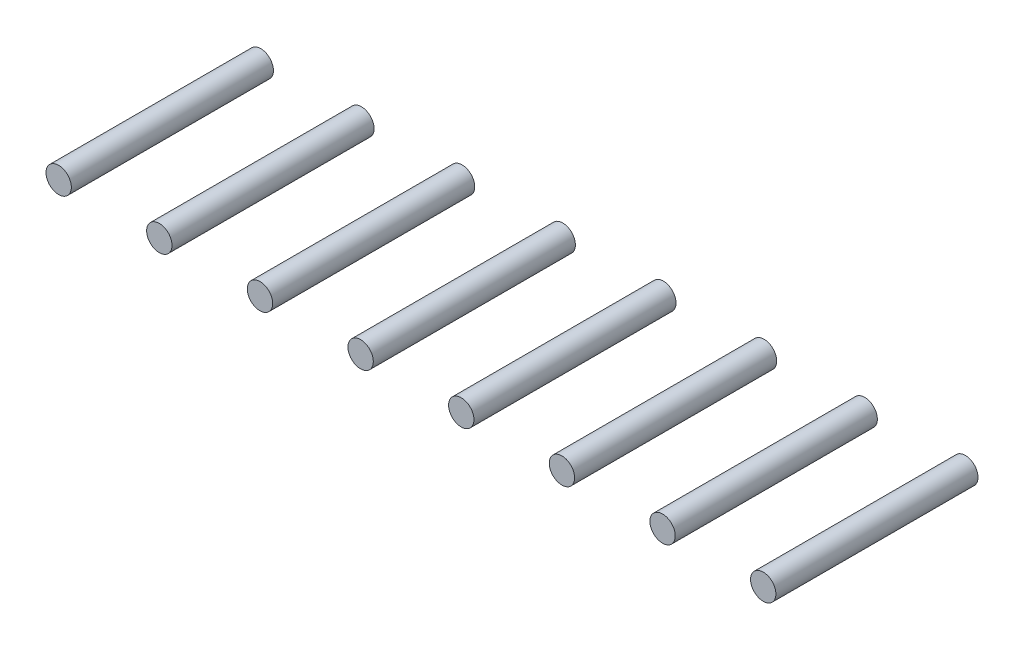
ISO-10303-21;
HEADER;
FILE_DESCRIPTION(('STEP AP214'),'2;1');
FILE_NAME('part.step','',(''),(''),'','','');
FILE_SCHEMA(('AUTOMOTIVE_DESIGN { 1 0 10303 214 1 1 1 1 }'));
ENDSEC;
DATA;
#1=APPLICATION_CONTEXT('core data for automotive mechanical design processes');
#2=APPLICATION_PROTOCOL_DEFINITION('international standard','automotive_design',2000,#1);
#3=PRODUCT_CONTEXT('',#1,'mechanical');
#4=PRODUCT('Part','Part','',(#3));
#5=PRODUCT_RELATED_PRODUCT_CATEGORY('part','',(#4));
#6=PRODUCT_DEFINITION_FORMATION('','',#4);
#7=PRODUCT_DEFINITION_CONTEXT('part definition',#1,'design');
#8=PRODUCT_DEFINITION('design','',#6,#7);
#9=PRODUCT_DEFINITION_SHAPE('','',#8);
#10=(LENGTH_UNIT() NAMED_UNIT(*) SI_UNIT(.MILLI.,.METRE.));
#11=(NAMED_UNIT(*) PLANE_ANGLE_UNIT() SI_UNIT($,.RADIAN.));
#12=(NAMED_UNIT(*) SI_UNIT($,.STERADIAN.) SOLID_ANGLE_UNIT());
#13=UNCERTAINTY_MEASURE_WITH_UNIT(LENGTH_MEASURE(1.E-05),#10,'distance_accuracy_value','');
#14=(GEOMETRIC_REPRESENTATION_CONTEXT(3) GLOBAL_UNCERTAINTY_ASSIGNED_CONTEXT((#13)) GLOBAL_UNIT_ASSIGNED_CONTEXT((#10,
#11,#12)) REPRESENTATION_CONTEXT('',''));
#15=CARTESIAN_POINT('',(0.,0.,0.));
#16=DIRECTION('',(0.,0.,1.));
#17=DIRECTION('',(1.,0.,0.));
#18=AXIS2_PLACEMENT_3D('',#15,#16,#17);
#19=CARTESIAN_POINT('',(0.,0.,-5.));
#20=DIRECTION('',(0.,0.,1.));
#21=DIRECTION('',(1.,0.,0.));
#22=AXIS2_PLACEMENT_3D('',#19,#20,#21);
#23=PLANE('',#22);
#24=CARTESIAN_POINT('',(0.,0.,-5.));
#25=DIRECTION('',(0.,0.,1.));
#26=DIRECTION('',(1.,0.,0.));
#27=AXIS2_PLACEMENT_3D('',#24,#25,#26);
#28=CIRCLE('',#27,0.32);
#29=CARTESIAN_POINT('',(0.32,0.,-5.));
#30=VERTEX_POINT('',#29);
#31=EDGE_CURVE('P0_E11',#30,#30,#28,.T.);
#32=ORIENTED_EDGE('',*,*,#31,.F.);
#33=EDGE_LOOP('',(#32));
#34=FACE_BOUND('',#33,.T.);
#35=ADVANCED_FACE('P0_F16',(#34),#23,.F.);
#36=CARTESIAN_POINT('',(0.,0.,0.1));
#37=DIRECTION('',(0.,0.,1.));
#38=DIRECTION('',(1.,0.,0.));
#39=AXIS2_PLACEMENT_3D('',#36,#37,#38);
#40=PLANE('',#39);
#41=CARTESIAN_POINT('',(0.,0.,0.1));
#42=DIRECTION('',(0.,0.,1.));
#43=DIRECTION('',(1.,0.,0.));
#44=AXIS2_PLACEMENT_3D('',#41,#42,#43);
#45=CIRCLE('',#44,0.32);
#46=CARTESIAN_POINT('',(0.32,0.,0.1));
#47=VERTEX_POINT('',#46);
#48=EDGE_CURVE('P0_E40',#47,#47,#45,.T.);
#49=ORIENTED_EDGE('',*,*,#48,.T.);
#50=EDGE_LOOP('',(#49));
#51=FACE_BOUND('',#50,.T.);
#52=ADVANCED_FACE('P0_F44',(#51),#40,.T.);
#53=CARTESIAN_POINT('',(0.,0.,-5.));
#54=DIRECTION('',(0.,0.,1.));
#55=DIRECTION('',(1.,0.,0.));
#56=AXIS2_PLACEMENT_3D('',#53,#54,#55);
#57=CYLINDRICAL_SURFACE('',#56,0.32);
#58=ORIENTED_EDGE('',*,*,#48,.F.);
#59=DIRECTION('',(0.,0.,1.));
#60=VECTOR('',#59,1.);
#61=CARTESIAN_POINT('',(0.32,0.,-5.));
#62=LINE('',#61,#60);
#63=EDGE_CURVE('P0_E26',#30,#47,#62,.T.);
#64=ORIENTED_EDGE('',*,*,#63,.F.);
#65=ORIENTED_EDGE('',*,*,#31,.T.);
#66=ORIENTED_EDGE('',*,*,#63,.T.);
#67=EDGE_LOOP('',(#58,#64,#65,#66));
#68=FACE_BOUND('',#67,.T.);
#69=ADVANCED_FACE('P0_F18',(#68),#57,.T.);
#70=CLOSED_SHELL('',(#35,#52,#69));
#71=MANIFOLD_SOLID_BREP('P0_B1',#70);
#72=CARTESIAN_POINT('',(2.54,0.,-5.));
#73=DIRECTION('',(0.,0.,1.));
#74=DIRECTION('',(1.,0.,0.));
#75=AXIS2_PLACEMENT_3D('',#72,#73,#74);
#76=PLANE('',#75);
#77=CARTESIAN_POINT('',(2.54,0.,-5.));
#78=DIRECTION('',(0.,0.,1.));
#79=DIRECTION('',(1.,0.,0.));
#80=AXIS2_PLACEMENT_3D('',#77,#78,#79);
#81=CIRCLE('',#80,0.32);
#82=CARTESIAN_POINT('',(2.86,0.,-5.));
#83=VERTEX_POINT('',#82);
#84=EDGE_CURVE('P1_E11',#83,#83,#81,.T.);
#85=ORIENTED_EDGE('',*,*,#84,.F.);
#86=EDGE_LOOP('',(#85));
#87=FACE_BOUND('',#86,.T.);
#88=ADVANCED_FACE('P1_F16',(#87),#76,.F.);
#89=CARTESIAN_POINT('',(2.54,0.,0.1));
#90=DIRECTION('',(0.,0.,1.));
#91=DIRECTION('',(1.,0.,0.));
#92=AXIS2_PLACEMENT_3D('',#89,#90,#91);
#93=PLANE('',#92);
#94=CARTESIAN_POINT('',(2.54,0.,0.1));
#95=DIRECTION('',(0.,0.,1.));
#96=DIRECTION('',(1.,0.,0.));
#97=AXIS2_PLACEMENT_3D('',#94,#95,#96);
#98=CIRCLE('',#97,0.32);
#99=CARTESIAN_POINT('',(2.86,0.,0.1));
#100=VERTEX_POINT('',#99);
#101=EDGE_CURVE('P1_E41',#100,#100,#98,.T.);
#102=ORIENTED_EDGE('',*,*,#101,.T.);
#103=EDGE_LOOP('',(#102));
#104=FACE_BOUND('',#103,.T.);
#105=ADVANCED_FACE('P1_F18',(#104),#93,.T.);
#106=CARTESIAN_POINT('',(2.54,0.,-5.));
#107=DIRECTION('',(0.,0.,1.));
#108=DIRECTION('',(1.,0.,0.));
#109=AXIS2_PLACEMENT_3D('',#106,#107,#108);
#110=CYLINDRICAL_SURFACE('',#109,0.32);
#111=ORIENTED_EDGE('',*,*,#101,.F.);
#112=DIRECTION('',(0.,0.,1.));
#113=VECTOR('',#112,1.);
#114=CARTESIAN_POINT('',(2.86,0.,-5.));
#115=LINE('',#114,#113);
#116=EDGE_CURVE('P1_E20',#83,#100,#115,.T.);
#117=ORIENTED_EDGE('',*,*,#116,.F.);
#118=ORIENTED_EDGE('',*,*,#84,.T.);
#119=ORIENTED_EDGE('',*,*,#116,.T.);
#120=EDGE_LOOP('',(#111,#117,#118,#119));
#121=FACE_BOUND('',#120,.T.);
#122=ADVANCED_FACE('P1_F40',(#121),#110,.T.);
#123=CLOSED_SHELL('',(#88,#105,#122));
#124=MANIFOLD_SOLID_BREP('P1_B1',#123);
#125=CARTESIAN_POINT('',(5.08,0.,-5.));
#126=DIRECTION('',(0.,0.,1.));
#127=DIRECTION('',(1.,0.,0.));
#128=AXIS2_PLACEMENT_3D('',#125,#126,#127);
#129=PLANE('',#128);
#130=CARTESIAN_POINT('',(5.08,0.,-5.));
#131=DIRECTION('',(0.,0.,1.));
#132=DIRECTION('',(1.,0.,0.));
#133=AXIS2_PLACEMENT_3D('',#130,#131,#132);
#134=CIRCLE('',#133,0.32);
#135=CARTESIAN_POINT('',(5.4,0.,-5.));
#136=VERTEX_POINT('',#135);
#137=EDGE_CURVE('P2_E11',#136,#136,#134,.T.);
#138=ORIENTED_EDGE('',*,*,#137,.F.);
#139=EDGE_LOOP('',(#138));
#140=FACE_BOUND('',#139,.T.);
#141=ADVANCED_FACE('P2_F16',(#140),#129,.F.);
#142=CARTESIAN_POINT('',(5.08,0.,0.1));
#143=DIRECTION('',(0.,0.,1.));
#144=DIRECTION('',(1.,0.,0.));
#145=AXIS2_PLACEMENT_3D('',#142,#143,#144);
#146=PLANE('',#145);
#147=CARTESIAN_POINT('',(5.08,0.,0.1));
#148=DIRECTION('',(0.,0.,1.));
#149=DIRECTION('',(1.,0.,0.));
#150=AXIS2_PLACEMENT_3D('',#147,#148,#149);
#151=CIRCLE('',#150,0.32);
#152=CARTESIAN_POINT('',(5.4,0.,0.1));
#153=VERTEX_POINT('',#152);
#154=EDGE_CURVE('P2_E40',#153,#153,#151,.T.);
#155=ORIENTED_EDGE('',*,*,#154,.T.);
#156=EDGE_LOOP('',(#155));
#157=FACE_BOUND('',#156,.T.);
#158=ADVANCED_FACE('P2_F43',(#157),#146,.T.);
#159=CARTESIAN_POINT('',(5.08,0.,-5.));
#160=DIRECTION('',(0.,0.,1.));
#161=DIRECTION('',(1.,0.,0.));
#162=AXIS2_PLACEMENT_3D('',#159,#160,#161);
#163=CYLINDRICAL_SURFACE('',#162,0.32);
#164=ORIENTED_EDGE('',*,*,#154,.F.);
#165=DIRECTION('',(0.,0.,1.));
#166=VECTOR('',#165,1.);
#167=CARTESIAN_POINT('',(5.4,0.,-5.));
#168=LINE('',#167,#166);
#169=EDGE_CURVE('P2_E20',#136,#153,#168,.T.);
#170=ORIENTED_EDGE('',*,*,#169,.F.);
#171=ORIENTED_EDGE('',*,*,#137,.T.);
#172=ORIENTED_EDGE('',*,*,#169,.T.);
#173=EDGE_LOOP('',(#164,#170,#171,#172));
#174=FACE_BOUND('',#173,.T.);
#175=ADVANCED_FACE('P2_F18',(#174),#163,.T.);
#176=CLOSED_SHELL('',(#141,#158,#175));
#177=MANIFOLD_SOLID_BREP('P2_B1',#176);
#178=CARTESIAN_POINT('',(7.62,0.,-5.));
#179=DIRECTION('',(0.,0.,1.));
#180=DIRECTION('',(1.,0.,0.));
#181=AXIS2_PLACEMENT_3D('',#178,#179,#180);
#182=PLANE('',#181);
#183=CARTESIAN_POINT('',(7.62,0.,-5.));
#184=DIRECTION('',(0.,0.,1.));
#185=DIRECTION('',(1.,0.,0.));
#186=AXIS2_PLACEMENT_3D('',#183,#184,#185);
#187=CIRCLE('',#186,0.32);
#188=CARTESIAN_POINT('',(7.94,0.,-5.));
#189=VERTEX_POINT('',#188);
#190=EDGE_CURVE('P3_E11',#189,#189,#187,.T.);
#191=ORIENTED_EDGE('',*,*,#190,.F.);
#192=EDGE_LOOP('',(#191));
#193=FACE_BOUND('',#192,.T.);
#194=ADVANCED_FACE('P3_F16',(#193),#182,.F.);
#195=CARTESIAN_POINT('',(7.62,0.,0.1));
#196=DIRECTION('',(0.,0.,1.));
#197=DIRECTION('',(1.,0.,0.));
#198=AXIS2_PLACEMENT_3D('',#195,#196,#197);
#199=PLANE('',#198);
#200=CARTESIAN_POINT('',(7.62,0.,0.1));
#201=DIRECTION('',(0.,0.,1.));
#202=DIRECTION('',(1.,0.,0.));
#203=AXIS2_PLACEMENT_3D('',#200,#201,#202);
#204=CIRCLE('',#203,0.32);
#205=CARTESIAN_POINT('',(7.94,0.,0.1));
#206=VERTEX_POINT('',#205);
#207=EDGE_CURVE('P3_E41',#206,#206,#204,.T.);
#208=ORIENTED_EDGE('',*,*,#207,.T.);
#209=EDGE_LOOP('',(#208));
#210=FACE_BOUND('',#209,.T.);
#211=ADVANCED_FACE('P3_F18',(#210),#199,.T.);
#212=CARTESIAN_POINT('',(7.62,0.,-5.));
#213=DIRECTION('',(0.,0.,1.));
#214=DIRECTION('',(1.,0.,0.));
#215=AXIS2_PLACEMENT_3D('',#212,#213,#214);
#216=CYLINDRICAL_SURFACE('',#215,0.32);
#217=ORIENTED_EDGE('',*,*,#207,.F.);
#218=DIRECTION('',(0.,0.,1.));
#219=VECTOR('',#218,1.);
#220=CARTESIAN_POINT('',(7.94,0.,-5.));
#221=LINE('',#220,#219);
#222=EDGE_CURVE('P3_E20',#189,#206,#221,.T.);
#223=ORIENTED_EDGE('',*,*,#222,.F.);
#224=ORIENTED_EDGE('',*,*,#190,.T.);
#225=ORIENTED_EDGE('',*,*,#222,.T.);
#226=EDGE_LOOP('',(#217,#223,#224,#225));
#227=FACE_BOUND('',#226,.T.);
#228=ADVANCED_FACE('P3_F40',(#227),#216,.T.);
#229=CLOSED_SHELL('',(#194,#211,#228));
#230=MANIFOLD_SOLID_BREP('P3_B1',#229);
#231=CARTESIAN_POINT('',(10.16,0.,-5.));
#232=DIRECTION('',(0.,0.,1.));
#233=DIRECTION('',(1.,0.,0.));
#234=AXIS2_PLACEMENT_3D('',#231,#232,#233);
#235=PLANE('',#234);
#236=CARTESIAN_POINT('',(10.16,0.,-5.));
#237=DIRECTION('',(0.,0.,1.));
#238=DIRECTION('',(1.,0.,0.));
#239=AXIS2_PLACEMENT_3D('',#236,#237,#238);
#240=CIRCLE('',#239,0.32);
#241=CARTESIAN_POINT('',(10.48,0.,-5.));
#242=VERTEX_POINT('',#241);
#243=EDGE_CURVE('P4_E11',#242,#242,#240,.T.);
#244=ORIENTED_EDGE('',*,*,#243,.F.);
#245=EDGE_LOOP('',(#244));
#246=FACE_BOUND('',#245,.T.);
#247=ADVANCED_FACE('P4_F16',(#246),#235,.F.);
#248=CARTESIAN_POINT('',(10.16,0.,0.1));
#249=DIRECTION('',(0.,0.,1.));
#250=DIRECTION('',(1.,0.,0.));
#251=AXIS2_PLACEMENT_3D('',#248,#249,#250);
#252=PLANE('',#251);
#253=CARTESIAN_POINT('',(10.16,0.,0.1));
#254=DIRECTION('',(0.,0.,1.));
#255=DIRECTION('',(1.,0.,0.));
#256=AXIS2_PLACEMENT_3D('',#253,#254,#255);
#257=CIRCLE('',#256,0.32);
#258=CARTESIAN_POINT('',(10.48,0.,0.1));
#259=VERTEX_POINT('',#258);
#260=EDGE_CURVE('P4_E20',#259,#259,#257,.T.);
#261=ORIENTED_EDGE('',*,*,#260,.T.);
#262=EDGE_LOOP('',(#261));
#263=FACE_BOUND('',#262,.T.);
#264=ADVANCED_FACE('P4_F18',(#263),#252,.T.);
#265=CARTESIAN_POINT('',(10.16,0.,-5.));
#266=DIRECTION('',(0.,0.,1.));
#267=DIRECTION('',(1.,0.,0.));
#268=AXIS2_PLACEMENT_3D('',#265,#266,#267);
#269=CYLINDRICAL_SURFACE('',#268,0.32);
#270=ORIENTED_EDGE('',*,*,#260,.F.);
#271=DIRECTION('',(0.,0.,1.));
#272=VECTOR('',#271,1.);
#273=CARTESIAN_POINT('',(10.48,0.,-5.));
#274=LINE('',#273,#272);
#275=EDGE_CURVE('P4_E27',#242,#259,#274,.T.);
#276=ORIENTED_EDGE('',*,*,#275,.F.);
#277=ORIENTED_EDGE('',*,*,#243,.T.);
#278=ORIENTED_EDGE('',*,*,#275,.T.);
#279=EDGE_LOOP('',(#270,#276,#277,#278));
#280=FACE_BOUND('',#279,.T.);
#281=ADVANCED_FACE('P4_F41',(#280),#269,.T.);
#282=CLOSED_SHELL('',(#247,#264,#281));
#283=MANIFOLD_SOLID_BREP('P4_B1',#282);
#284=CARTESIAN_POINT('',(12.7,0.,-5.));
#285=DIRECTION('',(0.,0.,1.));
#286=DIRECTION('',(1.,0.,0.));
#287=AXIS2_PLACEMENT_3D('',#284,#285,#286);
#288=PLANE('',#287);
#289=CARTESIAN_POINT('',(12.7,0.,-5.));
#290=DIRECTION('',(0.,0.,1.));
#291=DIRECTION('',(1.,0.,0.));
#292=AXIS2_PLACEMENT_3D('',#289,#290,#291);
#293=CIRCLE('',#292,0.32);
#294=CARTESIAN_POINT('',(13.02,0.,-5.));
#295=VERTEX_POINT('',#294);
#296=EDGE_CURVE('P5_E11',#295,#295,#293,.T.);
#297=ORIENTED_EDGE('',*,*,#296,.F.);
#298=EDGE_LOOP('',(#297));
#299=FACE_BOUND('',#298,.T.);
#300=ADVANCED_FACE('P5_F16',(#299),#288,.F.);
#301=CARTESIAN_POINT('',(12.7,0.,0.1));
#302=DIRECTION('',(0.,0.,1.));
#303=DIRECTION('',(1.,0.,0.));
#304=AXIS2_PLACEMENT_3D('',#301,#302,#303);
#305=PLANE('',#304);
#306=CARTESIAN_POINT('',(12.7,0.,0.1));
#307=DIRECTION('',(0.,0.,1.));
#308=DIRECTION('',(1.,0.,0.));
#309=AXIS2_PLACEMENT_3D('',#306,#307,#308);
#310=CIRCLE('',#309,0.32);
#311=CARTESIAN_POINT('',(13.02,0.,0.1));
#312=VERTEX_POINT('',#311);
#313=EDGE_CURVE('P5_E19',#312,#312,#310,.T.);
#314=ORIENTED_EDGE('',*,*,#313,.T.);
#315=EDGE_LOOP('',(#314));
#316=FACE_BOUND('',#315,.T.);
#317=ADVANCED_FACE('P5_F44',(#316),#305,.T.);
#318=CARTESIAN_POINT('',(12.7,0.,-5.));
#319=DIRECTION('',(0.,0.,1.));
#320=DIRECTION('',(1.,0.,0.));
#321=AXIS2_PLACEMENT_3D('',#318,#319,#320);
#322=CYLINDRICAL_SURFACE('',#321,0.32);
#323=ORIENTED_EDGE('',*,*,#313,.F.);
#324=DIRECTION('',(0.,0.,1.));
#325=VECTOR('',#324,1.);
#326=CARTESIAN_POINT('',(13.02,0.,-5.));
#327=LINE('',#326,#325);
#328=EDGE_CURVE('P5_E26',#295,#312,#327,.T.);
#329=ORIENTED_EDGE('',*,*,#328,.F.);
#330=ORIENTED_EDGE('',*,*,#296,.T.);
#331=ORIENTED_EDGE('',*,*,#328,.T.);
#332=EDGE_LOOP('',(#323,#329,#330,#331));
#333=FACE_BOUND('',#332,.T.);
#334=ADVANCED_FACE('P5_F40',(#333),#322,.T.);
#335=CLOSED_SHELL('',(#300,#317,#334));
#336=MANIFOLD_SOLID_BREP('P5_B1',#335);
#337=CARTESIAN_POINT('',(15.24,0.,-5.));
#338=DIRECTION('',(0.,0.,1.));
#339=DIRECTION('',(1.,0.,0.));
#340=AXIS2_PLACEMENT_3D('',#337,#338,#339);
#341=PLANE('',#340);
#342=CARTESIAN_POINT('',(15.24,0.,-5.));
#343=DIRECTION('',(0.,0.,1.));
#344=DIRECTION('',(1.,0.,0.));
#345=AXIS2_PLACEMENT_3D('',#342,#343,#344);
#346=CIRCLE('',#345,0.32);
#347=CARTESIAN_POINT('',(15.56,0.,-5.));
#348=VERTEX_POINT('',#347);
#349=EDGE_CURVE('P6_E11',#348,#348,#346,.T.);
#350=ORIENTED_EDGE('',*,*,#349,.F.);
#351=EDGE_LOOP('',(#350));
#352=FACE_BOUND('',#351,.T.);
#353=ADVANCED_FACE('P6_F16',(#352),#341,.F.);
#354=CARTESIAN_POINT('',(15.24,0.,0.1));
#355=DIRECTION('',(0.,0.,1.));
#356=DIRECTION('',(1.,0.,0.));
#357=AXIS2_PLACEMENT_3D('',#354,#355,#356);
#358=PLANE('',#357);
#359=CARTESIAN_POINT('',(15.24,0.,0.1));
#360=DIRECTION('',(0.,0.,1.));
#361=DIRECTION('',(1.,0.,0.));
#362=AXIS2_PLACEMENT_3D('',#359,#360,#361);
#363=CIRCLE('',#362,0.32);
#364=CARTESIAN_POINT('',(15.56,0.,0.1));
#365=VERTEX_POINT('',#364);
#366=EDGE_CURVE('P6_E40',#365,#365,#363,.T.);
#367=ORIENTED_EDGE('',*,*,#366,.T.);
#368=EDGE_LOOP('',(#367));
#369=FACE_BOUND('',#368,.T.);
#370=ADVANCED_FACE('P6_F44',(#369),#358,.T.);
#371=CARTESIAN_POINT('',(15.24,0.,-5.));
#372=DIRECTION('',(0.,0.,1.));
#373=DIRECTION('',(1.,0.,0.));
#374=AXIS2_PLACEMENT_3D('',#371,#372,#373);
#375=CYLINDRICAL_SURFACE('',#374,0.32);
#376=ORIENTED_EDGE('',*,*,#366,.F.);
#377=DIRECTION('',(0.,0.,1.));
#378=VECTOR('',#377,1.);
#379=CARTESIAN_POINT('',(15.56,0.,-5.));
#380=LINE('',#379,#378);
#381=EDGE_CURVE('P6_E25',#348,#365,#380,.T.);
#382=ORIENTED_EDGE('',*,*,#381,.F.);
#383=ORIENTED_EDGE('',*,*,#349,.T.);
#384=ORIENTED_EDGE('',*,*,#381,.T.);
#385=EDGE_LOOP('',(#376,#382,#383,#384));
#386=FACE_BOUND('',#385,.T.);
#387=ADVANCED_FACE('P6_F39',(#386),#375,.T.);
#388=CLOSED_SHELL('',(#353,#370,#387));
#389=MANIFOLD_SOLID_BREP('P6_B1',#388);
#390=CARTESIAN_POINT('',(17.78,0.,-5.));
#391=DIRECTION('',(0.,0.,1.));
#392=DIRECTION('',(1.,0.,0.));
#393=AXIS2_PLACEMENT_3D('',#390,#391,#392);
#394=PLANE('',#393);
#395=CARTESIAN_POINT('',(17.78,0.,-5.));
#396=DIRECTION('',(0.,0.,1.));
#397=DIRECTION('',(1.,0.,0.));
#398=AXIS2_PLACEMENT_3D('',#395,#396,#397);
#399=CIRCLE('',#398,0.32);
#400=CARTESIAN_POINT('',(18.1,0.,-5.));
#401=VERTEX_POINT('',#400);
#402=EDGE_CURVE('P7_E11',#401,#401,#399,.T.);
#403=ORIENTED_EDGE('',*,*,#402,.F.);
#404=EDGE_LOOP('',(#403));
#405=FACE_BOUND('',#404,.T.);
#406=ADVANCED_FACE('P7_F16',(#405),#394,.F.);
#407=CARTESIAN_POINT('',(17.78,0.,0.1));
#408=DIRECTION('',(0.,0.,1.));
#409=DIRECTION('',(1.,0.,0.));
#410=AXIS2_PLACEMENT_3D('',#407,#408,#409);
#411=PLANE('',#410);
#412=CARTESIAN_POINT('',(17.78,0.,0.1));
#413=DIRECTION('',(0.,0.,1.));
#414=DIRECTION('',(1.,0.,0.));
#415=AXIS2_PLACEMENT_3D('',#412,#413,#414);
#416=CIRCLE('',#415,0.32);
#417=CARTESIAN_POINT('',(18.1,0.,0.1));
#418=VERTEX_POINT('',#417);
#419=EDGE_CURVE('P7_E41',#418,#418,#416,.T.);
#420=ORIENTED_EDGE('',*,*,#419,.T.);
#421=EDGE_LOOP('',(#420));
#422=FACE_BOUND('',#421,.T.);
#423=ADVANCED_FACE('P7_F18',(#422),#411,.T.);
#424=CARTESIAN_POINT('',(17.78,0.,-5.));
#425=DIRECTION('',(0.,0.,1.));
#426=DIRECTION('',(1.,0.,0.));
#427=AXIS2_PLACEMENT_3D('',#424,#425,#426);
#428=CYLINDRICAL_SURFACE('',#427,0.32);
#429=ORIENTED_EDGE('',*,*,#419,.F.);
#430=DIRECTION('',(0.,0.,1.));
#431=VECTOR('',#430,1.);
#432=CARTESIAN_POINT('',(18.1,0.,-5.));
#433=LINE('',#432,#431);
#434=EDGE_CURVE('P7_E25',#401,#418,#433,.T.);
#435=ORIENTED_EDGE('',*,*,#434,.F.);
#436=ORIENTED_EDGE('',*,*,#402,.T.);
#437=ORIENTED_EDGE('',*,*,#434,.T.);
#438=EDGE_LOOP('',(#429,#435,#436,#437));
#439=FACE_BOUND('',#438,.T.);
#440=ADVANCED_FACE('P7_F40',(#439),#428,.T.);
#441=CLOSED_SHELL('',(#406,#423,#440));
#442=MANIFOLD_SOLID_BREP('P7_B1',#441);
#443=ADVANCED_BREP_SHAPE_REPRESENTATION('',(#18,#71,#124,#177,#230,#283,#336,#389,#442),#14);
#444=SHAPE_DEFINITION_REPRESENTATION(#9,#443);
ENDSEC;
END-ISO-10303-21;
